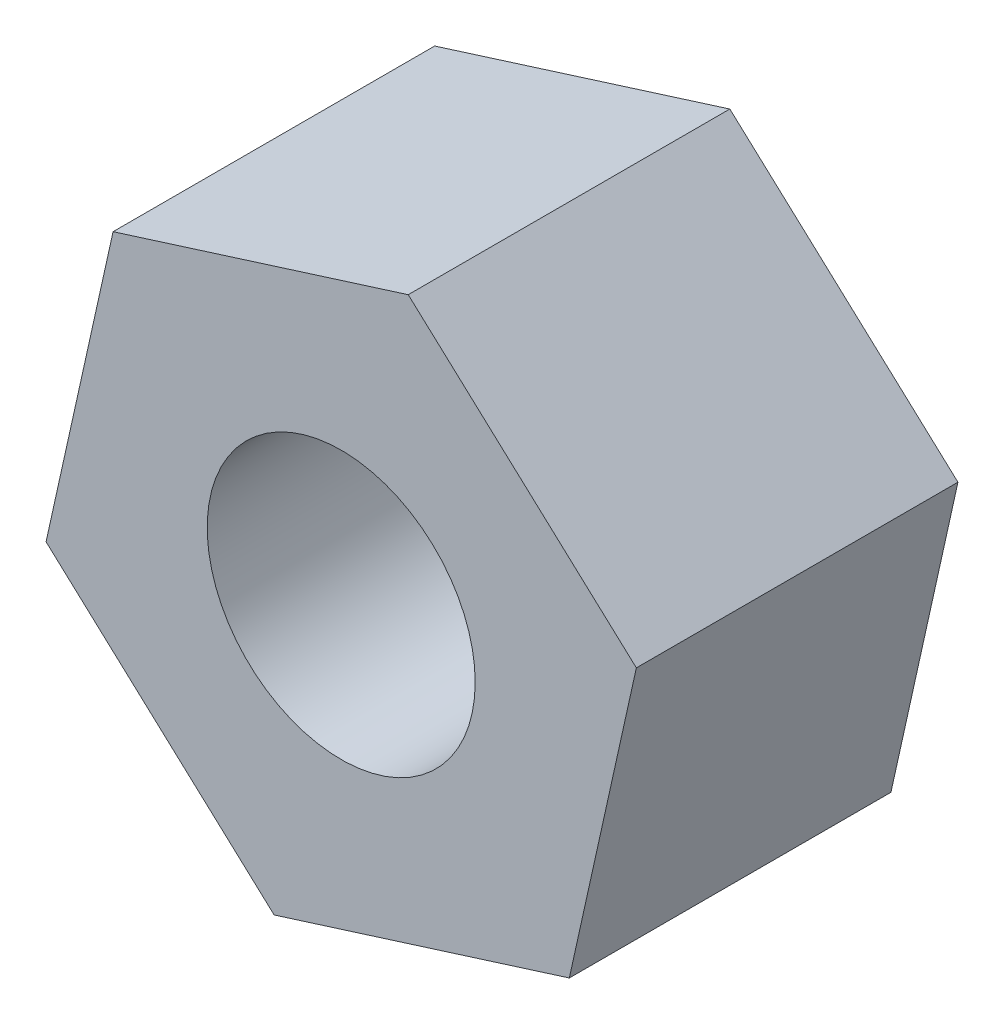
ISO-10303-21;
HEADER;
FILE_DESCRIPTION(('STEP AP214'),'2;1');
FILE_NAME('part.step','',(''),(''),'','','');
FILE_SCHEMA(('AUTOMOTIVE_DESIGN { 1 0 10303 214 1 1 1 1 }'));
ENDSEC;
DATA;
#1=APPLICATION_CONTEXT('core data for automotive mechanical design processes');
#2=APPLICATION_PROTOCOL_DEFINITION('international standard','automotive_design',2000,#1);
#3=PRODUCT_CONTEXT('',#1,'mechanical');
#4=PRODUCT('Part','Part','',(#3));
#5=PRODUCT_RELATED_PRODUCT_CATEGORY('part','',(#4));
#6=PRODUCT_DEFINITION_FORMATION('','',#4);
#7=PRODUCT_DEFINITION_CONTEXT('part definition',#1,'design');
#8=PRODUCT_DEFINITION('design','',#6,#7);
#9=PRODUCT_DEFINITION_SHAPE('','',#8);
#10=(LENGTH_UNIT() NAMED_UNIT(*) SI_UNIT(.MILLI.,.METRE.));
#11=(NAMED_UNIT(*) PLANE_ANGLE_UNIT() SI_UNIT($,.RADIAN.));
#12=(NAMED_UNIT(*) SI_UNIT($,.STERADIAN.) SOLID_ANGLE_UNIT());
#13=UNCERTAINTY_MEASURE_WITH_UNIT(LENGTH_MEASURE(1.E-05),#10,'distance_accuracy_value','');
#14=(GEOMETRIC_REPRESENTATION_CONTEXT(3) GLOBAL_UNCERTAINTY_ASSIGNED_CONTEXT((#13)) GLOBAL_UNIT_ASSIGNED_CONTEXT((#10,
#11,#12)) REPRESENTATION_CONTEXT('',''));
#15=CARTESIAN_POINT('',(0.,0.,0.));
#16=DIRECTION('',(0.,0.,1.));
#17=DIRECTION('',(1.,0.,0.));
#18=AXIS2_PLACEMENT_3D('',#15,#16,#17);
#19=CARTESIAN_POINT('',(-1.25064243619096,-5.63641968186647,6.));
#20=DIRECTION('',(-0.300531897660053,0.953771764359193,0.));
#21=DIRECTION('',(-0.953771764359193,-0.300531897660053,0.));
#22=AXIS2_PLACEMENT_3D('',#19,#20,#21);
#23=PLANE('',#22);
#24=DIRECTION('',(0.953771764359193,0.300531897660053,0.));
#25=VECTOR('',#24,1.);
#26=CARTESIAN_POINT('',(-1.25064243619096,-5.63641968186647,0.));
#27=LINE('',#26,#25);
#28=CARTESIAN_POINT('',(-1.25064243619096,-5.63641968186647,0.));
#29=VERTEX_POINT('',#28);
#30=CARTESIAN_POINT('',(4.25596141279148,-3.90129796172546,0.));
#31=VERTEX_POINT('',#30);
#32=EDGE_CURVE('E128',#29,#31,#27,.T.);
#33=ORIENTED_EDGE('',*,*,#32,.T.);
#34=DIRECTION('',(0.,0.,-1.));
#35=VECTOR('',#34,1.);
#36=CARTESIAN_POINT('',(4.25596141279148,-3.90129796172546,6.));
#37=LINE('',#36,#35);
#38=CARTESIAN_POINT('',(4.25596141279148,-3.90129796172546,6.));
#39=VERTEX_POINT('',#38);
#40=EDGE_CURVE('E11',#39,#31,#37,.T.);
#41=ORIENTED_EDGE('',*,*,#40,.F.);
#42=DIRECTION('',(0.953771764359193,0.300531897660053,0.));
#43=VECTOR('',#42,1.);
#44=CARTESIAN_POINT('',(-1.25064243619096,-5.63641968186647,6.));
#45=LINE('',#44,#43);
#46=CARTESIAN_POINT('',(-1.25064243619096,-5.63641968186647,6.));
#47=VERTEX_POINT('',#46);
#48=EDGE_CURVE('E145',#47,#39,#45,.T.);
#49=ORIENTED_EDGE('',*,*,#48,.F.);
#50=DIRECTION('',(0.,0.,-1.));
#51=VECTOR('',#50,1.);
#52=CARTESIAN_POINT('',(-1.25064243619096,-5.63641968186647,6.));
#53=LINE('',#52,#51);
#54=EDGE_CURVE('E124',#47,#29,#53,.T.);
#55=ORIENTED_EDGE('',*,*,#54,.T.);
#56=EDGE_LOOP('',(#33,#41,#49,#55));
#57=FACE_BOUND('',#56,.T.);
#58=ADVANCED_FACE('F39',(#57),#23,.F.);
#59=CARTESIAN_POINT('',(4.25596141279148,-3.90129796172546,6.));
#60=DIRECTION('',(-0.976256526177393,0.216617624158446,0.));
#61=DIRECTION('',(-0.216617624158446,-0.976256526177393,0.));
#62=AXIS2_PLACEMENT_3D('',#59,#60,#61);
#63=PLANE('',#62);
#64=DIRECTION('',(0.216617624158446,0.976256526177393,0.));
#65=VECTOR('',#64,1.);
#66=CARTESIAN_POINT('',(4.25596141279148,-3.90129796172546,0.));
#67=LINE('',#66,#65);
#68=CARTESIAN_POINT('',(5.50660384898244,1.73512172014101,0.));
#69=VERTEX_POINT('',#68);
#70=EDGE_CURVE('E132',#31,#69,#67,.T.);
#71=ORIENTED_EDGE('',*,*,#70,.T.);
#72=DIRECTION('',(0.,0.,-1.));
#73=VECTOR('',#72,1.);
#74=CARTESIAN_POINT('',(5.50660384898244,1.73512172014101,6.));
#75=LINE('',#74,#73);
#76=CARTESIAN_POINT('',(5.50660384898244,1.73512172014101,6.));
#77=VERTEX_POINT('',#76);
#78=EDGE_CURVE('E48',#77,#69,#75,.T.);
#79=ORIENTED_EDGE('',*,*,#78,.F.);
#80=DIRECTION('',(0.216617624158446,0.976256526177393,0.));
#81=VECTOR('',#80,1.);
#82=CARTESIAN_POINT('',(4.25596141279148,-3.90129796172546,6.));
#83=LINE('',#82,#81);
#84=EDGE_CURVE('E93',#39,#77,#83,.T.);
#85=ORIENTED_EDGE('',*,*,#84,.F.);
#86=ORIENTED_EDGE('',*,*,#40,.T.);
#87=EDGE_LOOP('',(#71,#79,#85,#86));
#88=FACE_BOUND('',#87,.T.);
#89=ADVANCED_FACE('F174',(#88),#63,.F.);
#90=CARTESIAN_POINT('',(5.50660384898244,1.73512172014101,6.));
#91=DIRECTION('',(-0.67572462851734,-0.737154140200747,0.));
#92=DIRECTION('',(0.737154140200747,-0.67572462851734,0.));
#93=AXIS2_PLACEMENT_3D('',#90,#91,#92);
#94=PLANE('',#93);
#95=DIRECTION('',(-0.737154140200747,0.67572462851734,0.));
#96=VECTOR('',#95,1.);
#97=CARTESIAN_POINT('',(5.50660384898244,1.73512172014101,0.));
#98=LINE('',#97,#96);
#99=CARTESIAN_POINT('',(1.25064243619096,5.63641968186647,0.));
#100=VERTEX_POINT('',#99);
#101=EDGE_CURVE('E136',#69,#100,#98,.T.);
#102=ORIENTED_EDGE('',*,*,#101,.T.);
#103=DIRECTION('',(0.,0.,-1.));
#104=VECTOR('',#103,1.);
#105=CARTESIAN_POINT('',(1.25064243619096,5.63641968186647,6.));
#106=LINE('',#105,#104);
#107=CARTESIAN_POINT('',(1.25064243619096,5.63641968186647,6.));
#108=VERTEX_POINT('',#107);
#109=EDGE_CURVE('E117',#108,#100,#106,.T.);
#110=ORIENTED_EDGE('',*,*,#109,.F.);
#111=DIRECTION('',(-0.737154140200747,0.67572462851734,0.));
#112=VECTOR('',#111,1.);
#113=CARTESIAN_POINT('',(5.50660384898244,1.73512172014101,6.));
#114=LINE('',#113,#112);
#115=EDGE_CURVE('E106',#77,#108,#114,.T.);
#116=ORIENTED_EDGE('',*,*,#115,.F.);
#117=ORIENTED_EDGE('',*,*,#78,.T.);
#118=EDGE_LOOP('',(#102,#110,#116,#117));
#119=FACE_BOUND('',#118,.T.);
#120=ADVANCED_FACE('F155',(#119),#94,.F.);
#121=CARTESIAN_POINT('',(1.25064243619096,5.63641968186647,6.));
#122=DIRECTION('',(0.300531897660052,-0.953771764359193,0.));
#123=DIRECTION('',(0.953771764359193,0.300531897660052,0.));
#124=AXIS2_PLACEMENT_3D('',#121,#122,#123);
#125=PLANE('',#124);
#126=DIRECTION('',(-0.953771764359193,-0.300531897660052,0.));
#127=VECTOR('',#126,1.);
#128=CARTESIAN_POINT('',(1.25064243619096,5.63641968186647,0.));
#129=LINE('',#128,#127);
#130=CARTESIAN_POINT('',(-4.25596141279149,3.90129796172546,0.));
#131=VERTEX_POINT('',#130);
#132=EDGE_CURVE('E115',#100,#131,#129,.T.);
#133=ORIENTED_EDGE('',*,*,#132,.T.);
#134=DIRECTION('',(0.,0.,-1.));
#135=VECTOR('',#134,1.);
#136=CARTESIAN_POINT('',(-4.25596141279149,3.90129796172546,6.));
#137=LINE('',#136,#135);
#138=CARTESIAN_POINT('',(-4.25596141279149,3.90129796172546,6.));
#139=VERTEX_POINT('',#138);
#140=EDGE_CURVE('E112',#139,#131,#137,.T.);
#141=ORIENTED_EDGE('',*,*,#140,.F.);
#142=DIRECTION('',(-0.953771764359193,-0.300531897660052,0.));
#143=VECTOR('',#142,1.);
#144=CARTESIAN_POINT('',(1.25064243619096,5.63641968186647,6.));
#145=LINE('',#144,#143);
#146=EDGE_CURVE('E100',#108,#139,#145,.T.);
#147=ORIENTED_EDGE('',*,*,#146,.F.);
#148=ORIENTED_EDGE('',*,*,#109,.T.);
#149=EDGE_LOOP('',(#133,#141,#147,#148));
#150=FACE_BOUND('',#149,.T.);
#151=ADVANCED_FACE('F113',(#150),#125,.F.);
#152=CARTESIAN_POINT('',(-4.25596141279149,3.90129796172546,6.));
#153=DIRECTION('',(0.976256526177393,-0.216617624158446,0.));
#154=DIRECTION('',(0.216617624158446,0.976256526177393,0.));
#155=AXIS2_PLACEMENT_3D('',#152,#153,#154);
#156=PLANE('',#155);
#157=DIRECTION('',(-0.216617624158446,-0.976256526177393,0.));
#158=VECTOR('',#157,1.);
#159=CARTESIAN_POINT('',(-4.25596141279149,3.90129796172546,0.));
#160=LINE('',#159,#158);
#161=CARTESIAN_POINT('',(-5.50660384898245,-1.735121720141,0.));
#162=VERTEX_POINT('',#161);
#163=EDGE_CURVE('E79',#131,#162,#160,.T.);
#164=ORIENTED_EDGE('',*,*,#163,.T.);
#165=DIRECTION('',(0.,0.,-1.));
#166=VECTOR('',#165,1.);
#167=CARTESIAN_POINT('',(-5.50660384898245,-1.735121720141,6.));
#168=LINE('',#167,#166);
#169=CARTESIAN_POINT('',(-5.50660384898245,-1.735121720141,6.));
#170=VERTEX_POINT('',#169);
#171=EDGE_CURVE('E118',#170,#162,#168,.T.);
#172=ORIENTED_EDGE('',*,*,#171,.F.);
#173=DIRECTION('',(-0.216617624158446,-0.976256526177393,0.));
#174=VECTOR('',#173,1.);
#175=CARTESIAN_POINT('',(-4.25596141279149,3.90129796172546,6.));
#176=LINE('',#175,#174);
#177=EDGE_CURVE('E104',#139,#170,#176,.T.);
#178=ORIENTED_EDGE('',*,*,#177,.F.);
#179=ORIENTED_EDGE('',*,*,#140,.T.);
#180=EDGE_LOOP('',(#164,#172,#178,#179));
#181=FACE_BOUND('',#180,.T.);
#182=ADVANCED_FACE('F120',(#181),#156,.F.);
#183=CARTESIAN_POINT('',(-5.50660384898245,-1.735121720141,6.));
#184=DIRECTION('',(0.67572462851734,0.737154140200747,0.));
#185=DIRECTION('',(-0.737154140200747,0.67572462851734,0.));
#186=AXIS2_PLACEMENT_3D('',#183,#184,#185);
#187=PLANE('',#186);
#188=DIRECTION('',(0.737154140200747,-0.67572462851734,0.));
#189=VECTOR('',#188,1.);
#190=CARTESIAN_POINT('',(-5.50660384898245,-1.735121720141,0.));
#191=LINE('',#190,#189);
#192=EDGE_CURVE('E85',#162,#29,#191,.T.);
#193=ORIENTED_EDGE('',*,*,#192,.T.);
#194=ORIENTED_EDGE('',*,*,#54,.F.);
#195=DIRECTION('',(0.737154140200747,-0.67572462851734,0.));
#196=VECTOR('',#195,1.);
#197=CARTESIAN_POINT('',(-5.50660384898245,-1.735121720141,6.));
#198=LINE('',#197,#196);
#199=EDGE_CURVE('E56',#170,#47,#198,.T.);
#200=ORIENTED_EDGE('',*,*,#199,.F.);
#201=ORIENTED_EDGE('',*,*,#171,.T.);
#202=EDGE_LOOP('',(#193,#194,#200,#201));
#203=FACE_BOUND('',#202,.T.);
#204=ADVANCED_FACE('F162',(#203),#187,.F.);
#205=CARTESIAN_POINT('',(0.,0.,6.));
#206=DIRECTION('',(0.,0.,1.));
#207=DIRECTION('',(1.,0.,0.));
#208=AXIS2_PLACEMENT_3D('',#205,#206,#207);
#209=PLANE('',#208);
#210=CARTESIAN_POINT('',(0.,0.,6.));
#211=DIRECTION('',(0.,0.,1.));
#212=DIRECTION('',(1.,0.,0.));
#213=AXIS2_PLACEMENT_3D('',#210,#211,#212);
#214=CIRCLE('',#213,2.5);
#215=CARTESIAN_POINT('',(2.5,0.,6.));
#216=VERTEX_POINT('',#215);
#217=EDGE_CURVE('E229',#216,#216,#214,.T.);
#218=ORIENTED_EDGE('',*,*,#217,.F.);
#219=EDGE_LOOP('',(#218));
#220=FACE_BOUND('',#219,.T.);
#221=ORIENTED_EDGE('',*,*,#48,.T.);
#222=ORIENTED_EDGE('',*,*,#84,.T.);
#223=ORIENTED_EDGE('',*,*,#115,.T.);
#224=ORIENTED_EDGE('',*,*,#146,.T.);
#225=ORIENTED_EDGE('',*,*,#177,.T.);
#226=ORIENTED_EDGE('',*,*,#199,.T.);
#227=EDGE_LOOP('',(#221,#222,#223,#224,#225,#226));
#228=FACE_BOUND('',#227,.T.);
#229=ADVANCED_FACE('F102',(#220,#228),#209,.T.);
#230=CARTESIAN_POINT('',(0.,0.,0.));
#231=DIRECTION('',(0.,0.,1.));
#232=DIRECTION('',(1.,0.,0.));
#233=AXIS2_PLACEMENT_3D('',#230,#231,#232);
#234=PLANE('',#233);
#235=CARTESIAN_POINT('',(0.,0.,0.));
#236=DIRECTION('',(0.,0.,1.));
#237=DIRECTION('',(1.,0.,0.));
#238=AXIS2_PLACEMENT_3D('',#235,#236,#237);
#239=CIRCLE('',#238,2.5);
#240=CARTESIAN_POINT('',(2.5,0.,0.));
#241=VERTEX_POINT('',#240);
#242=EDGE_CURVE('E133',#241,#241,#239,.T.);
#243=ORIENTED_EDGE('',*,*,#242,.T.);
#244=EDGE_LOOP('',(#243));
#245=FACE_BOUND('',#244,.T.);
#246=ORIENTED_EDGE('',*,*,#32,.F.);
#247=ORIENTED_EDGE('',*,*,#192,.F.);
#248=ORIENTED_EDGE('',*,*,#163,.F.);
#249=ORIENTED_EDGE('',*,*,#132,.F.);
#250=ORIENTED_EDGE('',*,*,#101,.F.);
#251=ORIENTED_EDGE('',*,*,#70,.F.);
#252=EDGE_LOOP('',(#246,#247,#248,#249,#250,#251));
#253=FACE_BOUND('',#252,.T.);
#254=ADVANCED_FACE('F158',(#245,#253),#234,.F.);
#255=CARTESIAN_POINT('',(0.,0.,0.));
#256=DIRECTION('',(0.,0.,1.));
#257=DIRECTION('',(1.,0.,0.));
#258=AXIS2_PLACEMENT_3D('',#255,#256,#257);
#259=CYLINDRICAL_SURFACE('',#258,2.5);
#260=ORIENTED_EDGE('',*,*,#242,.F.);
#261=EDGE_LOOP('',(#260));
#262=FACE_BOUND('',#261,.T.);
#263=ORIENTED_EDGE('',*,*,#217,.T.);
#264=EDGE_LOOP('',(#263));
#265=FACE_BOUND('',#264,.T.);
#266=ADVANCED_FACE('F211',(#262,#265),#259,.F.);
#267=CLOSED_SHELL('',(#58,#89,#120,#151,#182,#204,#229,#254,#266));
#268=MANIFOLD_SOLID_BREP('B2',#267);
#269=ADVANCED_BREP_SHAPE_REPRESENTATION('',(#18,#268),#14);
#270=SHAPE_DEFINITION_REPRESENTATION(#9,#269);
ENDSEC;
END-ISO-10303-21;
